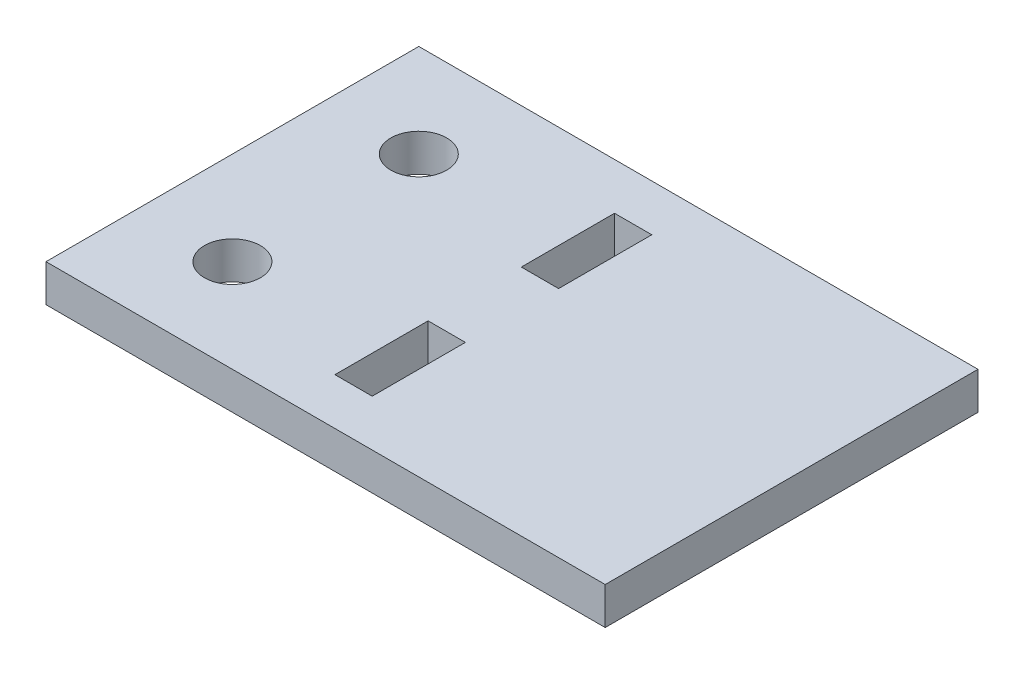
ISO-10303-21;
HEADER;
FILE_DESCRIPTION(('STEP AP214'),'2;1');
FILE_NAME('part.step','',(''),(''),'','','');
FILE_SCHEMA(('AUTOMOTIVE_DESIGN { 1 0 10303 214 1 1 1 1 }'));
ENDSEC;
DATA;
#1=APPLICATION_CONTEXT('core data for automotive mechanical design processes');
#2=APPLICATION_PROTOCOL_DEFINITION('international standard','automotive_design',2000,#1);
#3=PRODUCT_CONTEXT('',#1,'mechanical');
#4=PRODUCT('Part','Part','',(#3));
#5=PRODUCT_RELATED_PRODUCT_CATEGORY('part','',(#4));
#6=PRODUCT_DEFINITION_FORMATION('','',#4);
#7=PRODUCT_DEFINITION_CONTEXT('part definition',#1,'design');
#8=PRODUCT_DEFINITION('design','',#6,#7);
#9=PRODUCT_DEFINITION_SHAPE('','',#8);
#10=(LENGTH_UNIT() NAMED_UNIT(*) SI_UNIT(.MILLI.,.METRE.));
#11=(NAMED_UNIT(*) PLANE_ANGLE_UNIT() SI_UNIT($,.RADIAN.));
#12=(NAMED_UNIT(*) SI_UNIT($,.STERADIAN.) SOLID_ANGLE_UNIT());
#13=UNCERTAINTY_MEASURE_WITH_UNIT(LENGTH_MEASURE(1.E-05),#10,'distance_accuracy_value','');
#14=(GEOMETRIC_REPRESENTATION_CONTEXT(3) GLOBAL_UNCERTAINTY_ASSIGNED_CONTEXT((#13)) GLOBAL_UNIT_ASSIGNED_CONTEXT((#10,
#11,#12)) REPRESENTATION_CONTEXT('',''));
#15=CARTESIAN_POINT('',(0.,0.,0.));
#16=DIRECTION('',(0.,0.,1.));
#17=DIRECTION('',(1.,0.,0.));
#18=AXIS2_PLACEMENT_3D('',#15,#16,#17);
#19=CARTESIAN_POINT('',(0.,2.,0.));
#20=DIRECTION('',(0.,1.,0.));
#21=DIRECTION('',(0.,0.,1.));
#22=AXIS2_PLACEMENT_3D('',#19,#20,#21);
#23=PLANE('',#22);
#24=CARTESIAN_POINT('',(-10.,2.,5.00000000000001));
#25=DIRECTION('',(0.,1.,0.));
#26=DIRECTION('',(0.,0.,1.));
#27=AXIS2_PLACEMENT_3D('',#24,#25,#26);
#28=CIRCLE('',#27,1.5);
#29=CARTESIAN_POINT('',(-10.,2.,6.50000000000001));
#30=VERTEX_POINT('',#29);
#31=EDGE_CURVE('E227',#30,#30,#28,.T.);
#32=ORIENTED_EDGE('',*,*,#31,.F.);
#33=EDGE_LOOP('',(#32));
#34=FACE_BOUND('',#33,.T.);
#35=CARTESIAN_POINT('',(-10.,2.,-4.99999999999999));
#36=DIRECTION('',(0.,1.,0.));
#37=DIRECTION('',(0.,0.,1.));
#38=AXIS2_PLACEMENT_3D('',#35,#36,#37);
#39=CIRCLE('',#38,1.5);
#40=CARTESIAN_POINT('',(-10.,2.,-3.5));
#41=VERTEX_POINT('',#40);
#42=EDGE_CURVE('E220',#41,#41,#39,.T.);
#43=ORIENTED_EDGE('',*,*,#42,.F.);
#44=EDGE_LOOP('',(#43));
#45=FACE_BOUND('',#44,.T.);
#46=DIRECTION('',(0.,0.,-1.));
#47=VECTOR('',#46,1.);
#48=CARTESIAN_POINT('',(15.,2.,-9.99999999999999));
#49=LINE('',#48,#47);
#50=CARTESIAN_POINT('',(15.,2.,10.));
#51=VERTEX_POINT('',#50);
#52=CARTESIAN_POINT('',(15.,2.,-9.99999999999999));
#53=VERTEX_POINT('',#52);
#54=EDGE_CURVE('E195',#51,#53,#49,.T.);
#55=ORIENTED_EDGE('',*,*,#54,.T.);
#56=DIRECTION('',(-1.,0.,0.));
#57=VECTOR('',#56,1.);
#58=CARTESIAN_POINT('',(-15.,2.,-9.99999999999999));
#59=LINE('',#58,#57);
#60=CARTESIAN_POINT('',(-15.,2.,-9.99999999999999));
#61=VERTEX_POINT('',#60);
#62=EDGE_CURVE('E198',#53,#61,#59,.T.);
#63=ORIENTED_EDGE('',*,*,#62,.T.);
#64=DIRECTION('',(0.,0.,1.));
#65=VECTOR('',#64,1.);
#66=CARTESIAN_POINT('',(-15.,2.,-9.99999999999999));
#67=LINE('',#66,#65);
#68=CARTESIAN_POINT('',(-15.,2.,10.));
#69=VERTEX_POINT('',#68);
#70=EDGE_CURVE('E201',#61,#69,#67,.T.);
#71=ORIENTED_EDGE('',*,*,#70,.T.);
#72=DIRECTION('',(1.,0.,0.));
#73=VECTOR('',#72,1.);
#74=CARTESIAN_POINT('',(-15.,2.,10.));
#75=LINE('',#74,#73);
#76=EDGE_CURVE('E203',#69,#51,#75,.T.);
#77=ORIENTED_EDGE('',*,*,#76,.T.);
#78=EDGE_LOOP('',(#55,#63,#71,#77));
#79=FACE_BOUND('',#78,.T.);
#80=DIRECTION('',(0.,0.,1.));
#81=VECTOR('',#80,1.);
#82=CARTESIAN_POINT('',(-2.,2.,-7.49999999999999));
#83=LINE('',#82,#81);
#84=CARTESIAN_POINT('',(-2.,2.,-7.49999999999999));
#85=VERTEX_POINT('',#84);
#86=CARTESIAN_POINT('',(-2.,2.,-2.49999999999999));
#87=VERTEX_POINT('',#86);
#88=EDGE_CURVE('E166',#85,#87,#83,.T.);
#89=ORIENTED_EDGE('',*,*,#88,.F.);
#90=DIRECTION('',(-1.,0.,0.));
#91=VECTOR('',#90,1.);
#92=CARTESIAN_POINT('',(-2.,2.,-7.49999999999999));
#93=LINE('',#92,#91);
#94=CARTESIAN_POINT('',(0.,2.,-7.49999999999999));
#95=VERTEX_POINT('',#94);
#96=EDGE_CURVE('E164',#95,#85,#93,.T.);
#97=ORIENTED_EDGE('',*,*,#96,.F.);
#98=DIRECTION('',(0.,0.,-1.));
#99=VECTOR('',#98,1.);
#100=CARTESIAN_POINT('',(0.,2.,-7.49999999999999));
#101=LINE('',#100,#99);
#102=CARTESIAN_POINT('',(0.,2.,-2.49999999999999));
#103=VERTEX_POINT('',#102);
#104=EDGE_CURVE('E172',#103,#95,#101,.T.);
#105=ORIENTED_EDGE('',*,*,#104,.F.);
#106=DIRECTION('',(1.,0.,0.));
#107=VECTOR('',#106,1.);
#108=CARTESIAN_POINT('',(-2.,2.,-2.49999999999999));
#109=LINE('',#108,#107);
#110=EDGE_CURVE('E169',#87,#103,#109,.T.);
#111=ORIENTED_EDGE('',*,*,#110,.F.);
#112=EDGE_LOOP('',(#89,#97,#105,#111));
#113=FACE_BOUND('',#112,.T.);
#114=DIRECTION('',(0.,0.,1.));
#115=VECTOR('',#114,1.);
#116=CARTESIAN_POINT('',(-2.,2.,2.50000000000001));
#117=LINE('',#116,#115);
#118=CARTESIAN_POINT('',(-2.,2.,2.50000000000001));
#119=VERTEX_POINT('',#118);
#120=CARTESIAN_POINT('',(-2.,2.,7.50000000000001));
#121=VERTEX_POINT('',#120);
#122=EDGE_CURVE('E134',#119,#121,#117,.T.);
#123=ORIENTED_EDGE('',*,*,#122,.F.);
#124=DIRECTION('',(-1.,0.,0.));
#125=VECTOR('',#124,1.);
#126=CARTESIAN_POINT('',(-2.,2.,2.50000000000001));
#127=LINE('',#126,#125);
#128=CARTESIAN_POINT('',(0.,2.,2.50000000000001));
#129=VERTEX_POINT('',#128);
#130=EDGE_CURVE('E126',#129,#119,#127,.T.);
#131=ORIENTED_EDGE('',*,*,#130,.F.);
#132=DIRECTION('',(0.,0.,-1.));
#133=VECTOR('',#132,1.);
#134=CARTESIAN_POINT('',(0.,2.,2.50000000000001));
#135=LINE('',#134,#133);
#136=CARTESIAN_POINT('',(0.,2.,7.50000000000001));
#137=VERTEX_POINT('',#136);
#138=EDGE_CURVE('E148',#137,#129,#135,.T.);
#139=ORIENTED_EDGE('',*,*,#138,.F.);
#140=DIRECTION('',(1.,0.,0.));
#141=VECTOR('',#140,1.);
#142=CARTESIAN_POINT('',(-2.,2.,7.50000000000001));
#143=LINE('',#142,#141);
#144=EDGE_CURVE('E146',#121,#137,#143,.T.);
#145=ORIENTED_EDGE('',*,*,#144,.F.);
#146=EDGE_LOOP('',(#123,#131,#139,#145));
#147=FACE_BOUND('',#146,.T.);
#148=ADVANCED_FACE('F35',(#34,#45,#79,#113,#147),#23,.T.);
#149=CARTESIAN_POINT('',(0.,0.,0.));
#150=DIRECTION('',(0.,1.,0.));
#151=DIRECTION('',(0.,0.,1.));
#152=AXIS2_PLACEMENT_3D('',#149,#150,#151);
#153=PLANE('',#152);
#154=CARTESIAN_POINT('',(-10.,0.,5.00000000000001));
#155=DIRECTION('',(0.,1.,0.));
#156=DIRECTION('',(0.,0.,1.));
#157=AXIS2_PLACEMENT_3D('',#154,#155,#156);
#158=CIRCLE('',#157,1.5);
#159=CARTESIAN_POINT('',(-10.,0.,6.50000000000001));
#160=VERTEX_POINT('',#159);
#161=EDGE_CURVE('E39',#160,#160,#158,.T.);
#162=ORIENTED_EDGE('',*,*,#161,.T.);
#163=EDGE_LOOP('',(#162));
#164=FACE_BOUND('',#163,.T.);
#165=CARTESIAN_POINT('',(-10.,0.,-4.99999999999999));
#166=DIRECTION('',(0.,1.,0.));
#167=DIRECTION('',(0.,0.,1.));
#168=AXIS2_PLACEMENT_3D('',#165,#166,#167);
#169=CIRCLE('',#168,1.5);
#170=CARTESIAN_POINT('',(-10.,0.,-3.5));
#171=VERTEX_POINT('',#170);
#172=EDGE_CURVE('E154',#171,#171,#169,.T.);
#173=ORIENTED_EDGE('',*,*,#172,.T.);
#174=EDGE_LOOP('',(#173));
#175=FACE_BOUND('',#174,.T.);
#176=DIRECTION('',(-1.,0.,0.));
#177=VECTOR('',#176,1.);
#178=CARTESIAN_POINT('',(-2.,0.,-7.49999999999999));
#179=LINE('',#178,#177);
#180=CARTESIAN_POINT('',(0.,0.,-7.49999999999999));
#181=VERTEX_POINT('',#180);
#182=CARTESIAN_POINT('',(-2.,0.,-7.49999999999999));
#183=VERTEX_POINT('',#182);
#184=EDGE_CURVE('E142',#181,#183,#179,.T.);
#185=ORIENTED_EDGE('',*,*,#184,.T.);
#186=DIRECTION('',(0.,0.,1.));
#187=VECTOR('',#186,1.);
#188=CARTESIAN_POINT('',(-2.,0.,-7.49999999999999));
#189=LINE('',#188,#187);
#190=CARTESIAN_POINT('',(-2.,0.,-2.49999999999999));
#191=VERTEX_POINT('',#190);
#192=EDGE_CURVE('E177',#183,#191,#189,.T.);
#193=ORIENTED_EDGE('',*,*,#192,.T.);
#194=DIRECTION('',(1.,0.,0.));
#195=VECTOR('',#194,1.);
#196=CARTESIAN_POINT('',(-2.,0.,-2.49999999999999));
#197=LINE('',#196,#195);
#198=CARTESIAN_POINT('',(0.,0.,-2.49999999999999));
#199=VERTEX_POINT('',#198);
#200=EDGE_CURVE('E180',#191,#199,#197,.T.);
#201=ORIENTED_EDGE('',*,*,#200,.T.);
#202=DIRECTION('',(0.,0.,-1.));
#203=VECTOR('',#202,1.);
#204=CARTESIAN_POINT('',(0.,0.,-7.49999999999999));
#205=LINE('',#204,#203);
#206=EDGE_CURVE('E167',#199,#181,#205,.T.);
#207=ORIENTED_EDGE('',*,*,#206,.T.);
#208=EDGE_LOOP('',(#185,#193,#201,#207));
#209=FACE_BOUND('',#208,.T.);
#210=DIRECTION('',(0.,0.,-1.));
#211=VECTOR('',#210,1.);
#212=CARTESIAN_POINT('',(15.,0.,-9.99999999999999));
#213=LINE('',#212,#211);
#214=CARTESIAN_POINT('',(15.,0.,10.));
#215=VERTEX_POINT('',#214);
#216=CARTESIAN_POINT('',(15.,0.,-9.99999999999999));
#217=VERTEX_POINT('',#216);
#218=EDGE_CURVE('E194',#215,#217,#213,.T.);
#219=ORIENTED_EDGE('',*,*,#218,.F.);
#220=DIRECTION('',(1.,0.,0.));
#221=VECTOR('',#220,1.);
#222=CARTESIAN_POINT('',(-15.,0.,10.));
#223=LINE('',#222,#221);
#224=CARTESIAN_POINT('',(-15.,0.,10.));
#225=VERTEX_POINT('',#224);
#226=EDGE_CURVE('E199',#225,#215,#223,.T.);
#227=ORIENTED_EDGE('',*,*,#226,.F.);
#228=DIRECTION('',(0.,0.,1.));
#229=VECTOR('',#228,1.);
#230=CARTESIAN_POINT('',(-15.,0.,-9.99999999999999));
#231=LINE('',#230,#229);
#232=CARTESIAN_POINT('',(-15.,0.,-9.99999999999999));
#233=VERTEX_POINT('',#232);
#234=EDGE_CURVE('E210',#233,#225,#231,.T.);
#235=ORIENTED_EDGE('',*,*,#234,.F.);
#236=DIRECTION('',(-1.,0.,0.));
#237=VECTOR('',#236,1.);
#238=CARTESIAN_POINT('',(-15.,0.,-9.99999999999999));
#239=LINE('',#238,#237);
#240=EDGE_CURVE('E208',#217,#233,#239,.T.);
#241=ORIENTED_EDGE('',*,*,#240,.F.);
#242=EDGE_LOOP('',(#219,#227,#235,#241));
#243=FACE_BOUND('',#242,.T.);
#244=DIRECTION('',(-1.,0.,0.));
#245=VECTOR('',#244,1.);
#246=CARTESIAN_POINT('',(-2.,0.,2.50000000000001));
#247=LINE('',#246,#245);
#248=CARTESIAN_POINT('',(0.,0.,2.50000000000001));
#249=VERTEX_POINT('',#248);
#250=CARTESIAN_POINT('',(-2.,0.,2.50000000000001));
#251=VERTEX_POINT('',#250);
#252=EDGE_CURVE('E60',#249,#251,#247,.T.);
#253=ORIENTED_EDGE('',*,*,#252,.T.);
#254=DIRECTION('',(0.,0.,1.));
#255=VECTOR('',#254,1.);
#256=CARTESIAN_POINT('',(-2.,0.,2.50000000000001));
#257=LINE('',#256,#255);
#258=CARTESIAN_POINT('',(-2.,0.,7.50000000000001));
#259=VERTEX_POINT('',#258);
#260=EDGE_CURVE('E141',#251,#259,#257,.T.);
#261=ORIENTED_EDGE('',*,*,#260,.T.);
#262=DIRECTION('',(1.,0.,0.));
#263=VECTOR('',#262,1.);
#264=CARTESIAN_POINT('',(-2.,0.,7.50000000000001));
#265=LINE('',#264,#263);
#266=CARTESIAN_POINT('',(0.,0.,7.50000000000001));
#267=VERTEX_POINT('',#266);
#268=EDGE_CURVE('E156',#259,#267,#265,.T.);
#269=ORIENTED_EDGE('',*,*,#268,.T.);
#270=DIRECTION('',(0.,0.,-1.));
#271=VECTOR('',#270,1.);
#272=CARTESIAN_POINT('',(0.,0.,2.50000000000001));
#273=LINE('',#272,#271);
#274=EDGE_CURVE('E135',#267,#249,#273,.T.);
#275=ORIENTED_EDGE('',*,*,#274,.T.);
#276=EDGE_LOOP('',(#253,#261,#269,#275));
#277=FACE_BOUND('',#276,.T.);
#278=ADVANCED_FACE('F237',(#164,#175,#209,#243,#277),#153,.F.);
#279=CARTESIAN_POINT('',(15.,2.,-9.99999999999999));
#280=DIRECTION('',(-1.,0.,0.));
#281=DIRECTION('',(0.,0.,1.));
#282=AXIS2_PLACEMENT_3D('',#279,#280,#281);
#283=PLANE('',#282);
#284=ORIENTED_EDGE('',*,*,#218,.T.);
#285=DIRECTION('',(0.,-1.,0.));
#286=VECTOR('',#285,1.);
#287=CARTESIAN_POINT('',(15.,2.,-9.99999999999999));
#288=LINE('',#287,#286);
#289=EDGE_CURVE('E11',#53,#217,#288,.T.);
#290=ORIENTED_EDGE('',*,*,#289,.F.);
#291=ORIENTED_EDGE('',*,*,#54,.F.);
#292=DIRECTION('',(0.,-1.,0.));
#293=VECTOR('',#292,1.);
#294=CARTESIAN_POINT('',(15.,2.,10.));
#295=LINE('',#294,#293);
#296=EDGE_CURVE('E205',#51,#215,#295,.T.);
#297=ORIENTED_EDGE('',*,*,#296,.T.);
#298=EDGE_LOOP('',(#284,#290,#291,#297));
#299=FACE_BOUND('',#298,.T.);
#300=ADVANCED_FACE('F37',(#299),#283,.F.);
#301=CARTESIAN_POINT('',(-15.,2.,-9.99999999999999));
#302=DIRECTION('',(0.,0.,1.));
#303=DIRECTION('',(1.,0.,0.));
#304=AXIS2_PLACEMENT_3D('',#301,#302,#303);
#305=PLANE('',#304);
#306=ORIENTED_EDGE('',*,*,#240,.T.);
#307=DIRECTION('',(0.,-1.,0.));
#308=VECTOR('',#307,1.);
#309=CARTESIAN_POINT('',(-15.,2.,-9.99999999999999));
#310=LINE('',#309,#308);
#311=EDGE_CURVE('E44',#61,#233,#310,.T.);
#312=ORIENTED_EDGE('',*,*,#311,.F.);
#313=ORIENTED_EDGE('',*,*,#62,.F.);
#314=ORIENTED_EDGE('',*,*,#289,.T.);
#315=EDGE_LOOP('',(#306,#312,#313,#314));
#316=FACE_BOUND('',#315,.T.);
#317=ADVANCED_FACE('F285',(#316),#305,.F.);
#318=CARTESIAN_POINT('',(-15.,2.,-9.99999999999999));
#319=DIRECTION('',(1.,0.,0.));
#320=DIRECTION('',(0.,0.,-1.));
#321=AXIS2_PLACEMENT_3D('',#318,#319,#320);
#322=PLANE('',#321);
#323=ORIENTED_EDGE('',*,*,#234,.T.);
#324=DIRECTION('',(0.,-1.,0.));
#325=VECTOR('',#324,1.);
#326=CARTESIAN_POINT('',(-15.,2.,10.));
#327=LINE('',#326,#325);
#328=EDGE_CURVE('E215',#69,#225,#327,.T.);
#329=ORIENTED_EDGE('',*,*,#328,.F.);
#330=ORIENTED_EDGE('',*,*,#70,.F.);
#331=ORIENTED_EDGE('',*,*,#311,.T.);
#332=EDGE_LOOP('',(#323,#329,#330,#331));
#333=FACE_BOUND('',#332,.T.);
#334=ADVANCED_FACE('F282',(#333),#322,.F.);
#335=CARTESIAN_POINT('',(-15.,2.,10.));
#336=DIRECTION('',(0.,0.,-1.));
#337=DIRECTION('',(-1.,0.,0.));
#338=AXIS2_PLACEMENT_3D('',#335,#336,#337);
#339=PLANE('',#338);
#340=ORIENTED_EDGE('',*,*,#226,.T.);
#341=ORIENTED_EDGE('',*,*,#296,.F.);
#342=ORIENTED_EDGE('',*,*,#76,.F.);
#343=ORIENTED_EDGE('',*,*,#328,.T.);
#344=EDGE_LOOP('',(#340,#341,#342,#343));
#345=FACE_BOUND('',#344,.T.);
#346=ADVANCED_FACE('F275',(#345),#339,.F.);
#347=CARTESIAN_POINT('',(-2.,2.,-7.49999999999999));
#348=DIRECTION('',(0.,0.,1.));
#349=DIRECTION('',(1.,0.,0.));
#350=AXIS2_PLACEMENT_3D('',#347,#348,#349);
#351=PLANE('',#350);
#352=ORIENTED_EDGE('',*,*,#184,.F.);
#353=DIRECTION('',(0.,-1.,0.));
#354=VECTOR('',#353,1.);
#355=CARTESIAN_POINT('',(0.,2.,-7.49999999999999));
#356=LINE('',#355,#354);
#357=EDGE_CURVE('E174',#95,#181,#356,.T.);
#358=ORIENTED_EDGE('',*,*,#357,.F.);
#359=ORIENTED_EDGE('',*,*,#96,.T.);
#360=DIRECTION('',(0.,-1.,0.));
#361=VECTOR('',#360,1.);
#362=CARTESIAN_POINT('',(-2.,2.,-7.49999999999999));
#363=LINE('',#362,#361);
#364=EDGE_CURVE('E191',#85,#183,#363,.T.);
#365=ORIENTED_EDGE('',*,*,#364,.T.);
#366=EDGE_LOOP('',(#352,#358,#359,#365));
#367=FACE_BOUND('',#366,.T.);
#368=ADVANCED_FACE('F258',(#367),#351,.T.);
#369=CARTESIAN_POINT('',(-2.,2.,-7.49999999999999));
#370=DIRECTION('',(1.,0.,0.));
#371=DIRECTION('',(0.,0.,-1.));
#372=AXIS2_PLACEMENT_3D('',#369,#370,#371);
#373=PLANE('',#372);
#374=ORIENTED_EDGE('',*,*,#192,.F.);
#375=ORIENTED_EDGE('',*,*,#364,.F.);
#376=ORIENTED_EDGE('',*,*,#88,.T.);
#377=DIRECTION('',(0.,-1.,0.));
#378=VECTOR('',#377,1.);
#379=CARTESIAN_POINT('',(-2.,2.,-2.49999999999999));
#380=LINE('',#379,#378);
#381=EDGE_CURVE('E189',#87,#191,#380,.T.);
#382=ORIENTED_EDGE('',*,*,#381,.T.);
#383=EDGE_LOOP('',(#374,#375,#376,#382));
#384=FACE_BOUND('',#383,.T.);
#385=ADVANCED_FACE('F250',(#384),#373,.T.);
#386=CARTESIAN_POINT('',(-2.,2.,-2.49999999999999));
#387=DIRECTION('',(0.,0.,-1.));
#388=DIRECTION('',(-1.,0.,0.));
#389=AXIS2_PLACEMENT_3D('',#386,#387,#388);
#390=PLANE('',#389);
#391=ORIENTED_EDGE('',*,*,#200,.F.);
#392=ORIENTED_EDGE('',*,*,#381,.F.);
#393=ORIENTED_EDGE('',*,*,#110,.T.);
#394=DIRECTION('',(0.,-1.,0.));
#395=VECTOR('',#394,1.);
#396=CARTESIAN_POINT('',(0.,2.,-2.49999999999999));
#397=LINE('',#396,#395);
#398=EDGE_CURVE('E187',#103,#199,#397,.T.);
#399=ORIENTED_EDGE('',*,*,#398,.T.);
#400=EDGE_LOOP('',(#391,#392,#393,#399));
#401=FACE_BOUND('',#400,.T.);
#402=ADVANCED_FACE('F253',(#401),#390,.T.);
#403=CARTESIAN_POINT('',(0.,2.,-7.49999999999999));
#404=DIRECTION('',(-1.,0.,0.));
#405=DIRECTION('',(0.,0.,1.));
#406=AXIS2_PLACEMENT_3D('',#403,#404,#405);
#407=PLANE('',#406);
#408=ORIENTED_EDGE('',*,*,#206,.F.);
#409=ORIENTED_EDGE('',*,*,#398,.F.);
#410=ORIENTED_EDGE('',*,*,#104,.T.);
#411=ORIENTED_EDGE('',*,*,#357,.T.);
#412=EDGE_LOOP('',(#408,#409,#410,#411));
#413=FACE_BOUND('',#412,.T.);
#414=ADVANCED_FACE('F261',(#413),#407,.T.);
#415=CARTESIAN_POINT('',(-2.,2.,2.50000000000001));
#416=DIRECTION('',(0.,0.,1.));
#417=DIRECTION('',(1.,0.,0.));
#418=AXIS2_PLACEMENT_3D('',#415,#416,#417);
#419=PLANE('',#418);
#420=ORIENTED_EDGE('',*,*,#252,.F.);
#421=DIRECTION('',(0.,-1.,0.));
#422=VECTOR('',#421,1.);
#423=CARTESIAN_POINT('',(0.,2.,2.50000000000001));
#424=LINE('',#423,#422);
#425=EDGE_CURVE('E130',#129,#249,#424,.T.);
#426=ORIENTED_EDGE('',*,*,#425,.F.);
#427=ORIENTED_EDGE('',*,*,#130,.T.);
#428=DIRECTION('',(0.,-1.,0.));
#429=VECTOR('',#428,1.);
#430=CARTESIAN_POINT('',(-2.,2.,2.50000000000001));
#431=LINE('',#430,#429);
#432=EDGE_CURVE('E129',#119,#251,#431,.T.);
#433=ORIENTED_EDGE('',*,*,#432,.T.);
#434=EDGE_LOOP('',(#420,#426,#427,#433));
#435=FACE_BOUND('',#434,.T.);
#436=ADVANCED_FACE('F128',(#435),#419,.T.);
#437=CARTESIAN_POINT('',(-2.,2.,2.50000000000001));
#438=DIRECTION('',(1.,0.,0.));
#439=DIRECTION('',(0.,0.,-1.));
#440=AXIS2_PLACEMENT_3D('',#437,#438,#439);
#441=PLANE('',#440);
#442=ORIENTED_EDGE('',*,*,#260,.F.);
#443=ORIENTED_EDGE('',*,*,#432,.F.);
#444=ORIENTED_EDGE('',*,*,#122,.T.);
#445=DIRECTION('',(0.,-1.,0.));
#446=VECTOR('',#445,1.);
#447=CARTESIAN_POINT('',(-2.,2.,7.50000000000001));
#448=LINE('',#447,#446);
#449=EDGE_CURVE('E143',#121,#259,#448,.T.);
#450=ORIENTED_EDGE('',*,*,#449,.T.);
#451=EDGE_LOOP('',(#442,#443,#444,#450));
#452=FACE_BOUND('',#451,.T.);
#453=ADVANCED_FACE('F138',(#452),#441,.T.);
#454=CARTESIAN_POINT('',(-2.,2.,7.50000000000001));
#455=DIRECTION('',(0.,0.,-1.));
#456=DIRECTION('',(-1.,0.,0.));
#457=AXIS2_PLACEMENT_3D('',#454,#455,#456);
#458=PLANE('',#457);
#459=ORIENTED_EDGE('',*,*,#268,.F.);
#460=ORIENTED_EDGE('',*,*,#449,.F.);
#461=ORIENTED_EDGE('',*,*,#144,.T.);
#462=DIRECTION('',(0.,-1.,0.));
#463=VECTOR('',#462,1.);
#464=CARTESIAN_POINT('',(0.,2.,7.50000000000001));
#465=LINE('',#464,#463);
#466=EDGE_CURVE('E52',#137,#267,#465,.T.);
#467=ORIENTED_EDGE('',*,*,#466,.T.);
#468=EDGE_LOOP('',(#459,#460,#461,#467));
#469=FACE_BOUND('',#468,.T.);
#470=ADVANCED_FACE('F306',(#469),#458,.T.);
#471=CARTESIAN_POINT('',(0.,2.,2.50000000000001));
#472=DIRECTION('',(-1.,0.,0.));
#473=DIRECTION('',(0.,0.,1.));
#474=AXIS2_PLACEMENT_3D('',#471,#472,#473);
#475=PLANE('',#474);
#476=ORIENTED_EDGE('',*,*,#274,.F.);
#477=ORIENTED_EDGE('',*,*,#466,.F.);
#478=ORIENTED_EDGE('',*,*,#138,.T.);
#479=ORIENTED_EDGE('',*,*,#425,.T.);
#480=EDGE_LOOP('',(#476,#477,#478,#479));
#481=FACE_BOUND('',#480,.T.);
#482=ADVANCED_FACE('F303',(#481),#475,.T.);
#483=CARTESIAN_POINT('',(-10.,-8.,-4.99999999999999));
#484=DIRECTION('',(0.,1.,0.));
#485=DIRECTION('',(0.,0.,1.));
#486=AXIS2_PLACEMENT_3D('',#483,#484,#485);
#487=CYLINDRICAL_SURFACE('',#486,1.5);
#488=ORIENTED_EDGE('',*,*,#42,.T.);
#489=EDGE_LOOP('',(#488));
#490=FACE_BOUND('',#489,.T.);
#491=ORIENTED_EDGE('',*,*,#172,.F.);
#492=EDGE_LOOP('',(#491));
#493=FACE_BOUND('',#492,.T.);
#494=ADVANCED_FACE('F305',(#490,#493),#487,.F.);
#495=CARTESIAN_POINT('',(-10.,-8.,5.00000000000001));
#496=DIRECTION('',(0.,1.,0.));
#497=DIRECTION('',(0.,0.,1.));
#498=AXIS2_PLACEMENT_3D('',#495,#496,#497);
#499=CYLINDRICAL_SURFACE('',#498,1.5);
#500=ORIENTED_EDGE('',*,*,#31,.T.);
#501=EDGE_LOOP('',(#500));
#502=FACE_BOUND('',#501,.T.);
#503=ORIENTED_EDGE('',*,*,#161,.F.);
#504=EDGE_LOOP('',(#503));
#505=FACE_BOUND('',#504,.T.);
#506=ADVANCED_FACE('F232',(#502,#505),#499,.F.);
#507=CLOSED_SHELL('',(#148,#278,#300,#317,#334,#346,#368,#385,#402,#414,#436,#453,#470,#482,
#494,#506));
#508=MANIFOLD_SOLID_BREP('B2',#507);
#509=ADVANCED_BREP_SHAPE_REPRESENTATION('',(#18,#508),#14);
#510=SHAPE_DEFINITION_REPRESENTATION(#9,#509);
ENDSEC;
END-ISO-10303-21;
